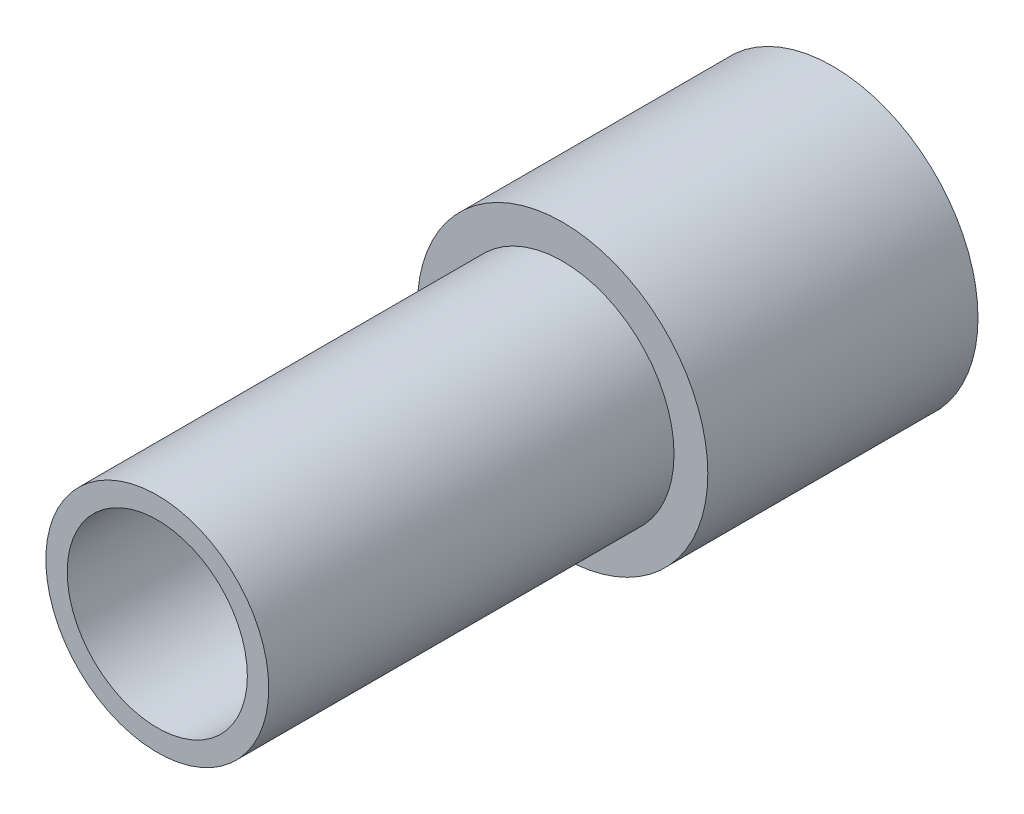
ISO-10303-21;
HEADER;
FILE_DESCRIPTION(('STEP AP214'),'2;1');
FILE_NAME('part.step','',(''),(''),'','','');
FILE_SCHEMA(('AUTOMOTIVE_DESIGN { 1 0 10303 214 1 1 1 1 }'));
ENDSEC;
DATA;
#1=APPLICATION_CONTEXT('core data for automotive mechanical design processes');
#2=APPLICATION_PROTOCOL_DEFINITION('international standard','automotive_design',2000,#1);
#3=PRODUCT_CONTEXT('',#1,'mechanical');
#4=PRODUCT('Part','Part','',(#3));
#5=PRODUCT_RELATED_PRODUCT_CATEGORY('part','',(#4));
#6=PRODUCT_DEFINITION_FORMATION('','',#4);
#7=PRODUCT_DEFINITION_CONTEXT('part definition',#1,'design');
#8=PRODUCT_DEFINITION('design','',#6,#7);
#9=PRODUCT_DEFINITION_SHAPE('','',#8);
#10=(LENGTH_UNIT() NAMED_UNIT(*) SI_UNIT(.MILLI.,.METRE.));
#11=(NAMED_UNIT(*) PLANE_ANGLE_UNIT() SI_UNIT($,.RADIAN.));
#12=(NAMED_UNIT(*) SI_UNIT($,.STERADIAN.) SOLID_ANGLE_UNIT());
#13=UNCERTAINTY_MEASURE_WITH_UNIT(LENGTH_MEASURE(1.E-05),#10,'distance_accuracy_value','');
#14=(GEOMETRIC_REPRESENTATION_CONTEXT(3) GLOBAL_UNCERTAINTY_ASSIGNED_CONTEXT((#13)) GLOBAL_UNIT_ASSIGNED_CONTEXT((#10,
#11,#12)) REPRESENTATION_CONTEXT('',''));
#15=CARTESIAN_POINT('',(0.,0.,0.));
#16=DIRECTION('',(0.,0.,1.));
#17=DIRECTION('',(1.,0.,0.));
#18=AXIS2_PLACEMENT_3D('',#15,#16,#17);
#19=CARTESIAN_POINT('',(0.,0.,30.));
#20=DIRECTION('',(0.,0.,1.));
#21=DIRECTION('',(1.,0.,0.));
#22=AXIS2_PLACEMENT_3D('',#19,#20,#21);
#23=PLANE('',#22);
#24=CARTESIAN_POINT('',(0.,0.,30.));
#25=DIRECTION('',(0.,0.,1.));
#26=DIRECTION('',(1.,0.,0.));
#27=AXIS2_PLACEMENT_3D('',#24,#25,#26);
#28=CIRCLE('',#27,4.);
#29=CARTESIAN_POINT('',(4.,0.,30.));
#30=VERTEX_POINT('',#29);
#31=EDGE_CURVE('E38',#30,#30,#28,.T.);
#32=ORIENTED_EDGE('',*,*,#31,.F.);
#33=EDGE_LOOP('',(#32));
#34=FACE_BOUND('',#33,.T.);
#35=CARTESIAN_POINT('',(0.,0.,30.));
#36=DIRECTION('',(0.,0.,1.));
#37=DIRECTION('',(1.,0.,0.));
#38=AXIS2_PLACEMENT_3D('',#35,#36,#37);
#39=CIRCLE('',#38,4.95);
#40=CARTESIAN_POINT('',(4.95,0.,30.));
#41=VERTEX_POINT('',#40);
#42=EDGE_CURVE('E52',#41,#41,#39,.T.);
#43=ORIENTED_EDGE('',*,*,#42,.T.);
#44=EDGE_LOOP('',(#43));
#45=FACE_BOUND('',#44,.T.);
#46=ADVANCED_FACE('F31',(#34,#45),#23,.T.);
#47=CARTESIAN_POINT('',(0.,0.,30.));
#48=DIRECTION('',(0.,0.,-1.));
#49=DIRECTION('',(-1.,0.,0.));
#50=AXIS2_PLACEMENT_3D('',#47,#48,#49);
#51=CYLINDRICAL_SURFACE('',#50,6.45);
#52=CARTESIAN_POINT('',(0.,0.,0.));
#53=DIRECTION('',(0.,0.,1.));
#54=DIRECTION('',(1.,0.,0.));
#55=AXIS2_PLACEMENT_3D('',#52,#53,#54);
#56=CIRCLE('',#55,6.45);
#57=CARTESIAN_POINT('',(6.45,0.,0.));
#58=VERTEX_POINT('',#57);
#59=EDGE_CURVE('E10',#58,#58,#56,.T.);
#60=ORIENTED_EDGE('',*,*,#59,.T.);
#61=EDGE_LOOP('',(#60));
#62=FACE_BOUND('',#61,.T.);
#63=CARTESIAN_POINT('',(0.,0.,12.));
#64=DIRECTION('',(0.,0.,1.));
#65=DIRECTION('',(1.,0.,0.));
#66=AXIS2_PLACEMENT_3D('',#63,#64,#65);
#67=CIRCLE('',#66,6.45);
#68=CARTESIAN_POINT('',(6.45,0.,12.));
#69=VERTEX_POINT('',#68);
#70=EDGE_CURVE('E47',#69,#69,#67,.T.);
#71=ORIENTED_EDGE('',*,*,#70,.F.);
#72=EDGE_LOOP('',(#71));
#73=FACE_BOUND('',#72,.T.);
#74=ADVANCED_FACE('F33',(#62,#73),#51,.T.);
#75=CARTESIAN_POINT('',(0.,0.,0.));
#76=DIRECTION('',(0.,0.,1.));
#77=DIRECTION('',(1.,0.,0.));
#78=AXIS2_PLACEMENT_3D('',#75,#76,#77);
#79=PLANE('',#78);
#80=ORIENTED_EDGE('',*,*,#59,.F.);
#81=EDGE_LOOP('',(#80));
#82=FACE_BOUND('',#81,.T.);
#83=CARTESIAN_POINT('',(0.,0.,0.));
#84=DIRECTION('',(0.,0.,1.));
#85=DIRECTION('',(1.,0.,0.));
#86=AXIS2_PLACEMENT_3D('',#83,#84,#85);
#87=CIRCLE('',#86,4.);
#88=CARTESIAN_POINT('',(4.,0.,0.));
#89=VERTEX_POINT('',#88);
#90=EDGE_CURVE('E42',#89,#89,#87,.T.);
#91=ORIENTED_EDGE('',*,*,#90,.T.);
#92=EDGE_LOOP('',(#91));
#93=FACE_BOUND('',#92,.T.);
#94=ADVANCED_FACE('F69',(#82,#93),#79,.F.);
#95=CARTESIAN_POINT('',(0.,0.,30.));
#96=DIRECTION('',(0.,0.,-1.));
#97=DIRECTION('',(-1.,0.,0.));
#98=AXIS2_PLACEMENT_3D('',#95,#96,#97);
#99=CYLINDRICAL_SURFACE('',#98,4.);
#100=ORIENTED_EDGE('',*,*,#31,.T.);
#101=EDGE_LOOP('',(#100));
#102=FACE_BOUND('',#101,.T.);
#103=ORIENTED_EDGE('',*,*,#90,.F.);
#104=EDGE_LOOP('',(#103));
#105=FACE_BOUND('',#104,.T.);
#106=ADVANCED_FACE('F64',(#102,#105),#99,.F.);
#107=CARTESIAN_POINT('',(0.,0.,12.));
#108=DIRECTION('',(0.,0.,1.));
#109=DIRECTION('',(1.,0.,0.));
#110=AXIS2_PLACEMENT_3D('',#107,#108,#109);
#111=PLANE('',#110);
#112=CARTESIAN_POINT('',(0.,0.,12.));
#113=DIRECTION('',(0.,0.,1.));
#114=DIRECTION('',(1.,0.,0.));
#115=AXIS2_PLACEMENT_3D('',#112,#113,#114);
#116=CIRCLE('',#115,4.95);
#117=CARTESIAN_POINT('',(4.95,0.,12.));
#118=VERTEX_POINT('',#117);
#119=EDGE_CURVE('E51',#118,#118,#116,.T.);
#120=ORIENTED_EDGE('',*,*,#119,.F.);
#121=EDGE_LOOP('',(#120));
#122=FACE_BOUND('',#121,.T.);
#123=ORIENTED_EDGE('',*,*,#70,.T.);
#124=EDGE_LOOP('',(#123));
#125=FACE_BOUND('',#124,.T.);
#126=ADVANCED_FACE('F61',(#122,#125),#111,.T.);
#127=CARTESIAN_POINT('',(0.,0.,12.));
#128=DIRECTION('',(0.,0.,1.));
#129=DIRECTION('',(1.,0.,0.));
#130=AXIS2_PLACEMENT_3D('',#127,#128,#129);
#131=CYLINDRICAL_SURFACE('',#130,4.95);
#132=ORIENTED_EDGE('',*,*,#119,.T.);
#133=EDGE_LOOP('',(#132));
#134=FACE_BOUND('',#133,.T.);
#135=ORIENTED_EDGE('',*,*,#42,.F.);
#136=EDGE_LOOP('',(#135));
#137=FACE_BOUND('',#136,.T.);
#138=ADVANCED_FACE('F58',(#134,#137),#131,.T.);
#139=CLOSED_SHELL('',(#46,#74,#94,#106,#126,#138));
#140=MANIFOLD_SOLID_BREP('B2',#139);
#141=ADVANCED_BREP_SHAPE_REPRESENTATION('',(#18,#140),#14);
#142=SHAPE_DEFINITION_REPRESENTATION(#9,#141);
ENDSEC;
END-ISO-10303-21;
